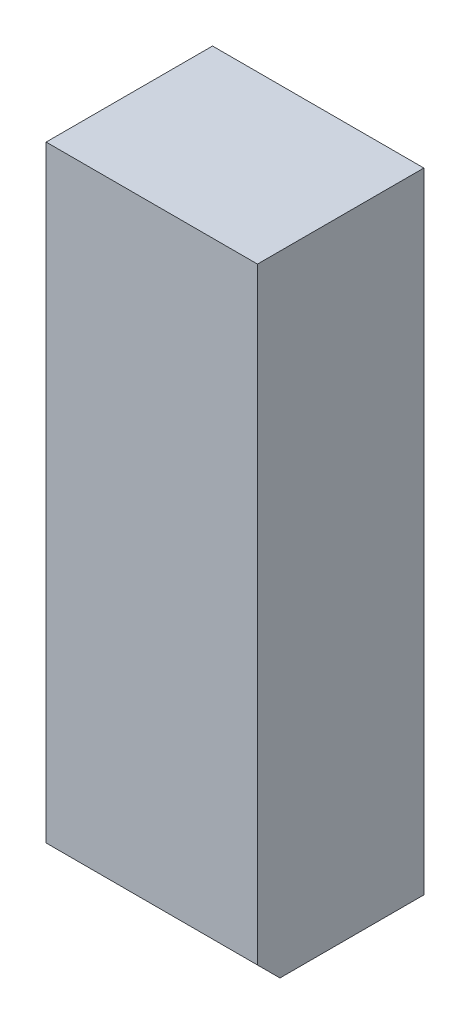
ISO-10303-21;
HEADER;
FILE_DESCRIPTION(('STEP AP214'),'2;1');
FILE_NAME('part.step','',(''),(''),'','','');
FILE_SCHEMA(('AUTOMOTIVE_DESIGN { 1 0 10303 214 1 1 1 1 }'));
ENDSEC;
DATA;
#1=APPLICATION_CONTEXT('core data for automotive mechanical design processes');
#2=APPLICATION_PROTOCOL_DEFINITION('international standard','automotive_design',2000,#1);
#3=PRODUCT_CONTEXT('',#1,'mechanical');
#4=PRODUCT('Part','Part','',(#3));
#5=PRODUCT_RELATED_PRODUCT_CATEGORY('part','',(#4));
#6=PRODUCT_DEFINITION_FORMATION('','',#4);
#7=PRODUCT_DEFINITION_CONTEXT('part definition',#1,'design');
#8=PRODUCT_DEFINITION('design','',#6,#7);
#9=PRODUCT_DEFINITION_SHAPE('','',#8);
#10=(LENGTH_UNIT() NAMED_UNIT(*) SI_UNIT(.MILLI.,.METRE.));
#11=(NAMED_UNIT(*) PLANE_ANGLE_UNIT() SI_UNIT($,.RADIAN.));
#12=(NAMED_UNIT(*) SI_UNIT($,.STERADIAN.) SOLID_ANGLE_UNIT());
#13=UNCERTAINTY_MEASURE_WITH_UNIT(LENGTH_MEASURE(1.E-05),#10,'distance_accuracy_value','');
#14=(GEOMETRIC_REPRESENTATION_CONTEXT(3) GLOBAL_UNCERTAINTY_ASSIGNED_CONTEXT((#13)) GLOBAL_UNIT_ASSIGNED_CONTEXT((#10,
#11,#12)) REPRESENTATION_CONTEXT('',''));
#15=CARTESIAN_POINT('',(0.,0.,0.));
#16=DIRECTION('',(0.,0.,1.));
#17=DIRECTION('',(1.,0.,0.));
#18=AXIS2_PLACEMENT_3D('',#15,#16,#17);
#19=CARTESIAN_POINT('',(47.,0.,0.));
#20=DIRECTION('',(0.,0.,-1.));
#21=DIRECTION('',(-1.,0.,0.));
#22=AXIS2_PLACEMENT_3D('',#19,#20,#21);
#23=PLANE('',#22);
#24=DIRECTION('',(0.,-1.,0.));
#25=VECTOR('',#24,1.);
#26=CARTESIAN_POINT('',(0.,0.,0.));
#27=LINE('',#26,#25);
#28=CARTESIAN_POINT('',(0.,0.,0.));
#29=VERTEX_POINT('',#28);
#30=CARTESIAN_POINT('',(0.,-140.,0.));
#31=VERTEX_POINT('',#30);
#32=EDGE_CURVE('E118',#29,#31,#27,.T.);
#33=ORIENTED_EDGE('',*,*,#32,.F.);
#34=DIRECTION('',(-1.,0.,0.));
#35=VECTOR('',#34,1.);
#36=CARTESIAN_POINT('',(47.,0.,0.));
#37=LINE('',#36,#35);
#38=CARTESIAN_POINT('',(47.,0.,0.));
#39=VERTEX_POINT('',#38);
#40=EDGE_CURVE('E11',#39,#29,#37,.T.);
#41=ORIENTED_EDGE('',*,*,#40,.F.);
#42=DIRECTION('',(0.,-1.,0.));
#43=VECTOR('',#42,1.);
#44=CARTESIAN_POINT('',(47.,0.,0.));
#45=LINE('',#44,#43);
#46=CARTESIAN_POINT('',(47.,-140.,0.));
#47=VERTEX_POINT('',#46);
#48=EDGE_CURVE('E113',#39,#47,#45,.T.);
#49=ORIENTED_EDGE('',*,*,#48,.T.);
#50=DIRECTION('',(-1.,0.,0.));
#51=VECTOR('',#50,1.);
#52=CARTESIAN_POINT('',(47.,-140.,0.));
#53=LINE('',#52,#51);
#54=EDGE_CURVE('E44',#47,#31,#53,.T.);
#55=ORIENTED_EDGE('',*,*,#54,.T.);
#56=EDGE_LOOP('',(#33,#41,#49,#55));
#57=FACE_BOUND('',#56,.T.);
#58=ADVANCED_FACE('F41',(#57),#23,.T.);
#59=CARTESIAN_POINT('',(47.,0.,37.));
#60=DIRECTION('',(0.,1.,0.));
#61=DIRECTION('',(0.,0.,1.));
#62=AXIS2_PLACEMENT_3D('',#59,#60,#61);
#63=PLANE('',#62);
#64=DIRECTION('',(0.,0.,-1.));
#65=VECTOR('',#64,1.);
#66=CARTESIAN_POINT('',(0.,0.,37.));
#67=LINE('',#66,#65);
#68=CARTESIAN_POINT('',(0.,0.,37.));
#69=VERTEX_POINT('',#68);
#70=EDGE_CURVE('E127',#69,#29,#67,.T.);
#71=ORIENTED_EDGE('',*,*,#70,.F.);
#72=DIRECTION('',(-1.,0.,0.));
#73=VECTOR('',#72,1.);
#74=CARTESIAN_POINT('',(47.,0.,37.));
#75=LINE('',#74,#73);
#76=CARTESIAN_POINT('',(47.,0.,37.));
#77=VERTEX_POINT('',#76);
#78=EDGE_CURVE('E50',#77,#69,#75,.T.);
#79=ORIENTED_EDGE('',*,*,#78,.F.);
#80=DIRECTION('',(0.,0.,-1.));
#81=VECTOR('',#80,1.);
#82=CARTESIAN_POINT('',(47.,0.,37.));
#83=LINE('',#82,#81);
#84=EDGE_CURVE('E108',#77,#39,#83,.T.);
#85=ORIENTED_EDGE('',*,*,#84,.T.);
#86=ORIENTED_EDGE('',*,*,#40,.T.);
#87=EDGE_LOOP('',(#71,#79,#85,#86));
#88=FACE_BOUND('',#87,.T.);
#89=ADVANCED_FACE('F133',(#88),#63,.T.);
#90=CARTESIAN_POINT('',(47.,-135.,37.));
#91=DIRECTION('',(0.,0.,1.));
#92=DIRECTION('',(1.,0.,0.));
#93=AXIS2_PLACEMENT_3D('',#90,#91,#92);
#94=PLANE('',#93);
#95=DIRECTION('',(0.,1.,0.));
#96=VECTOR('',#95,1.);
#97=CARTESIAN_POINT('',(0.,-135.,37.));
#98=LINE('',#97,#96);
#99=CARTESIAN_POINT('',(0.,-135.,37.));
#100=VERTEX_POINT('',#99);
#101=EDGE_CURVE('E97',#100,#69,#98,.T.);
#102=ORIENTED_EDGE('',*,*,#101,.F.);
#103=DIRECTION('',(-1.,0.,0.));
#104=VECTOR('',#103,1.);
#105=CARTESIAN_POINT('',(47.,-135.,37.));
#106=LINE('',#105,#104);
#107=CARTESIAN_POINT('',(47.,-135.,37.));
#108=VERTEX_POINT('',#107);
#109=EDGE_CURVE('E92',#108,#100,#106,.T.);
#110=ORIENTED_EDGE('',*,*,#109,.F.);
#111=DIRECTION('',(0.,1.,0.));
#112=VECTOR('',#111,1.);
#113=CARTESIAN_POINT('',(47.,-135.,37.));
#114=LINE('',#113,#112);
#115=EDGE_CURVE('E95',#108,#77,#114,.T.);
#116=ORIENTED_EDGE('',*,*,#115,.T.);
#117=ORIENTED_EDGE('',*,*,#78,.T.);
#118=EDGE_LOOP('',(#102,#110,#116,#117));
#119=FACE_BOUND('',#118,.T.);
#120=ADVANCED_FACE('F94',(#119),#94,.T.);
#121=CARTESIAN_POINT('',(47.,-140.,32.));
#122=DIRECTION('',(0.,-0.707106781186547,0.707106781186548));
#123=DIRECTION('',(0.,-0.707106781186548,-0.707106781186547));
#124=AXIS2_PLACEMENT_3D('',#121,#122,#123);
#125=PLANE('',#124);
#126=DIRECTION('',(0.,0.707106781186548,0.707106781186547));
#127=VECTOR('',#126,1.);
#128=CARTESIAN_POINT('',(0.,-140.,32.));
#129=LINE('',#128,#127);
#130=CARTESIAN_POINT('',(0.,-140.,32.));
#131=VERTEX_POINT('',#130);
#132=EDGE_CURVE('E124',#131,#100,#129,.T.);
#133=ORIENTED_EDGE('',*,*,#132,.F.);
#134=DIRECTION('',(-1.,0.,0.));
#135=VECTOR('',#134,1.);
#136=CARTESIAN_POINT('',(47.,-140.,32.));
#137=LINE('',#136,#135);
#138=CARTESIAN_POINT('',(47.,-140.,32.));
#139=VERTEX_POINT('',#138);
#140=EDGE_CURVE('E102',#139,#131,#137,.T.);
#141=ORIENTED_EDGE('',*,*,#140,.F.);
#142=DIRECTION('',(0.,0.707106781186548,0.707106781186547));
#143=VECTOR('',#142,1.);
#144=CARTESIAN_POINT('',(47.,-140.,32.));
#145=LINE('',#144,#143);
#146=EDGE_CURVE('E107',#139,#108,#145,.T.);
#147=ORIENTED_EDGE('',*,*,#146,.T.);
#148=ORIENTED_EDGE('',*,*,#109,.T.);
#149=EDGE_LOOP('',(#133,#141,#147,#148));
#150=FACE_BOUND('',#149,.T.);
#151=ADVANCED_FACE('F110',(#150),#125,.T.);
#152=CARTESIAN_POINT('',(47.,-140.,0.));
#153=DIRECTION('',(0.,-1.,0.));
#154=DIRECTION('',(0.,0.,-1.));
#155=AXIS2_PLACEMENT_3D('',#152,#153,#154);
#156=PLANE('',#155);
#157=DIRECTION('',(0.,0.,1.));
#158=VECTOR('',#157,1.);
#159=CARTESIAN_POINT('',(0.,-140.,0.));
#160=LINE('',#159,#158);
#161=EDGE_CURVE('E121',#31,#131,#160,.T.);
#162=ORIENTED_EDGE('',*,*,#161,.F.);
#163=ORIENTED_EDGE('',*,*,#54,.F.);
#164=DIRECTION('',(0.,0.,1.));
#165=VECTOR('',#164,1.);
#166=CARTESIAN_POINT('',(47.,-140.,0.));
#167=LINE('',#166,#165);
#168=EDGE_CURVE('E111',#47,#139,#167,.T.);
#169=ORIENTED_EDGE('',*,*,#168,.T.);
#170=ORIENTED_EDGE('',*,*,#140,.T.);
#171=EDGE_LOOP('',(#162,#163,#169,#170));
#172=FACE_BOUND('',#171,.T.);
#173=ADVANCED_FACE('F130',(#172),#156,.T.);
#174=CARTESIAN_POINT('',(47.,0.,0.));
#175=DIRECTION('',(-1.,0.,0.));
#176=DIRECTION('',(0.,0.,1.));
#177=AXIS2_PLACEMENT_3D('',#174,#175,#176);
#178=PLANE('',#177);
#179=ORIENTED_EDGE('',*,*,#48,.F.);
#180=ORIENTED_EDGE('',*,*,#84,.F.);
#181=ORIENTED_EDGE('',*,*,#115,.F.);
#182=ORIENTED_EDGE('',*,*,#146,.F.);
#183=ORIENTED_EDGE('',*,*,#168,.F.);
#184=EDGE_LOOP('',(#179,#180,#181,#182,#183));
#185=FACE_BOUND('',#184,.T.);
#186=ADVANCED_FACE('F106',(#185),#178,.F.);
#187=CARTESIAN_POINT('',(0.,0.,0.));
#188=DIRECTION('',(-1.,0.,0.));
#189=DIRECTION('',(0.,0.,1.));
#190=AXIS2_PLACEMENT_3D('',#187,#188,#189);
#191=PLANE('',#190);
#192=ORIENTED_EDGE('',*,*,#32,.T.);
#193=ORIENTED_EDGE('',*,*,#161,.T.);
#194=ORIENTED_EDGE('',*,*,#132,.T.);
#195=ORIENTED_EDGE('',*,*,#101,.T.);
#196=ORIENTED_EDGE('',*,*,#70,.T.);
#197=EDGE_LOOP('',(#192,#193,#194,#195,#196));
#198=FACE_BOUND('',#197,.T.);
#199=ADVANCED_FACE('F132',(#198),#191,.T.);
#200=CLOSED_SHELL('',(#58,#89,#120,#151,#173,#186,#199));
#201=MANIFOLD_SOLID_BREP('B2',#200);
#202=ADVANCED_BREP_SHAPE_REPRESENTATION('',(#18,#201),#14);
#203=SHAPE_DEFINITION_REPRESENTATION(#9,#202);
ENDSEC;
END-ISO-10303-21;
